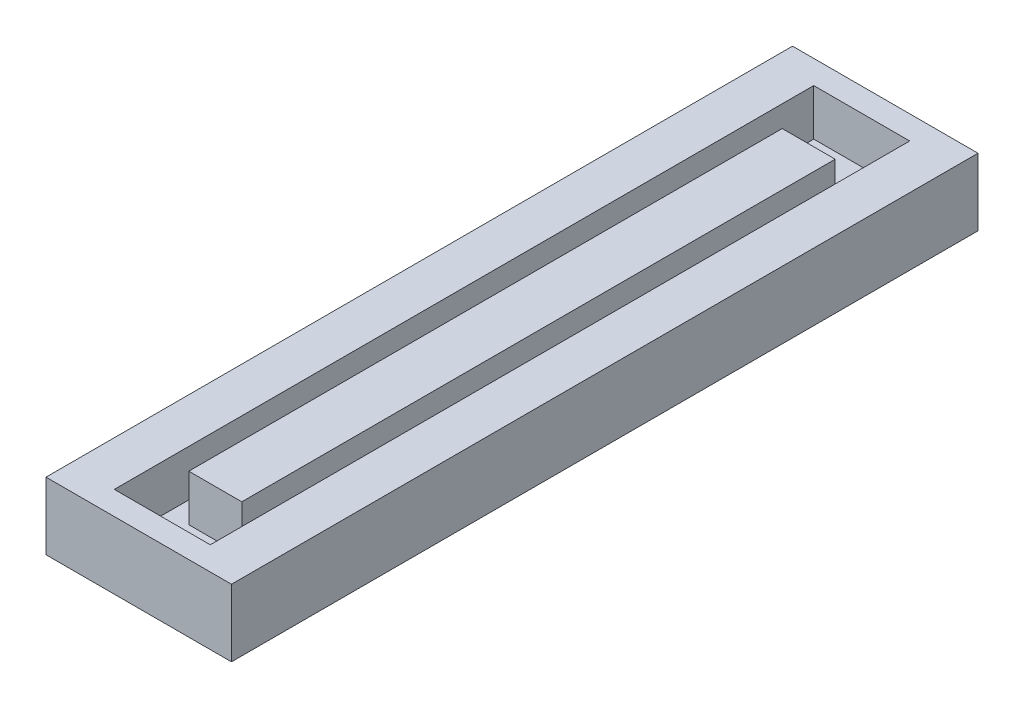
ISO-10303-21;
HEADER;
FILE_DESCRIPTION(('STEP AP214'),'2;1');
FILE_NAME('part.step','',(''),(''),'','','');
FILE_SCHEMA(('AUTOMOTIVE_DESIGN { 1 0 10303 214 1 1 1 1 }'));
ENDSEC;
DATA;
#1=APPLICATION_CONTEXT('core data for automotive mechanical design processes');
#2=APPLICATION_PROTOCOL_DEFINITION('international standard','automotive_design',2000,#1);
#3=PRODUCT_CONTEXT('',#1,'mechanical');
#4=PRODUCT('Part','Part','',(#3));
#5=PRODUCT_RELATED_PRODUCT_CATEGORY('part','',(#4));
#6=PRODUCT_DEFINITION_FORMATION('','',#4);
#7=PRODUCT_DEFINITION_CONTEXT('part definition',#1,'design');
#8=PRODUCT_DEFINITION('design','',#6,#7);
#9=PRODUCT_DEFINITION_SHAPE('','',#8);
#10=(LENGTH_UNIT() NAMED_UNIT(*) SI_UNIT(.MILLI.,.METRE.));
#11=(NAMED_UNIT(*) PLANE_ANGLE_UNIT() SI_UNIT($,.RADIAN.));
#12=(NAMED_UNIT(*) SI_UNIT($,.STERADIAN.) SOLID_ANGLE_UNIT());
#13=UNCERTAINTY_MEASURE_WITH_UNIT(LENGTH_MEASURE(1.E-05),#10,'distance_accuracy_value','');
#14=(GEOMETRIC_REPRESENTATION_CONTEXT(3) GLOBAL_UNCERTAINTY_ASSIGNED_CONTEXT((#13)) GLOBAL_UNIT_ASSIGNED_CONTEXT((#10,
#11,#12)) REPRESENTATION_CONTEXT('',''));
#15=CARTESIAN_POINT('',(0.,0.,0.));
#16=DIRECTION('',(0.,0.,1.));
#17=DIRECTION('',(1.,0.,0.));
#18=AXIS2_PLACEMENT_3D('',#15,#16,#17);
#19=CARTESIAN_POINT('',(1.0348,0.45,-7.542));
#20=DIRECTION('',(0.,1.,0.));
#21=DIRECTION('',(-1.,0.,0.));
#22=AXIS2_PLACEMENT_3D('',#19,#20,#21);
#23=PLANE('',#22);
#24=DIRECTION('',(0.,0.,-1.));
#25=VECTOR('',#24,1.);
#26=CARTESIAN_POINT('',(1.0348,0.45,7.542));
#27=LINE('',#26,#25);
#28=CARTESIAN_POINT('',(1.0348,0.45,7.542));
#29=VERTEX_POINT('',#28);
#30=CARTESIAN_POINT('',(1.0348,0.45,-7.542));
#31=VERTEX_POINT('',#30);
#32=EDGE_CURVE('E154',#29,#31,#27,.T.);
#33=ORIENTED_EDGE('',*,*,#32,.T.);
#34=DIRECTION('',(-1.,0.,0.));
#35=VECTOR('',#34,1.);
#36=CARTESIAN_POINT('',(1.0348,0.45,-7.542));
#37=LINE('',#36,#35);
#38=CARTESIAN_POINT('',(-1.0348,0.45,-7.542));
#39=VERTEX_POINT('',#38);
#40=EDGE_CURVE('E157',#31,#39,#37,.T.);
#41=ORIENTED_EDGE('',*,*,#40,.T.);
#42=DIRECTION('',(0.,0.,1.));
#43=VECTOR('',#42,1.);
#44=CARTESIAN_POINT('',(-1.0348,0.45,-7.542));
#45=LINE('',#44,#43);
#46=CARTESIAN_POINT('',(-1.0348,0.45,7.542));
#47=VERTEX_POINT('',#46);
#48=EDGE_CURVE('E161',#39,#47,#45,.T.);
#49=ORIENTED_EDGE('',*,*,#48,.T.);
#50=DIRECTION('',(1.,0.,0.));
#51=VECTOR('',#50,1.);
#52=CARTESIAN_POINT('',(-1.0348,0.45,7.542));
#53=LINE('',#52,#51);
#54=EDGE_CURVE('E164',#47,#29,#53,.T.);
#55=ORIENTED_EDGE('',*,*,#54,.T.);
#56=EDGE_LOOP('',(#33,#41,#49,#55));
#57=FACE_BOUND('',#56,.T.);
#58=DIRECTION('',(1.,0.,0.));
#59=VECTOR('',#58,1.);
#60=CARTESIAN_POINT('',(0.5715,0.45,6.399));
#61=LINE('',#60,#59);
#62=CARTESIAN_POINT('',(-0.5715,0.45,6.399));
#63=VERTEX_POINT('',#62);
#64=CARTESIAN_POINT('',(0.5715,0.45,6.399));
#65=VERTEX_POINT('',#64);
#66=EDGE_CURVE('E378',#63,#65,#61,.T.);
#67=ORIENTED_EDGE('',*,*,#66,.F.);
#68=DIRECTION('',(0.,0.,1.));
#69=VECTOR('',#68,1.);
#70=CARTESIAN_POINT('',(-0.5715,0.45,6.399));
#71=LINE('',#70,#69);
#72=CARTESIAN_POINT('',(-0.5715,0.45,-6.399));
#73=VERTEX_POINT('',#72);
#74=EDGE_CURVE('E146',#73,#63,#71,.T.);
#75=ORIENTED_EDGE('',*,*,#74,.F.);
#76=DIRECTION('',(-1.,0.,0.));
#77=VECTOR('',#76,1.);
#78=CARTESIAN_POINT('',(-0.5715,0.45,-6.399));
#79=LINE('',#78,#77);
#80=CARTESIAN_POINT('',(0.5715,0.45,-6.399));
#81=VERTEX_POINT('',#80);
#82=EDGE_CURVE('E142',#81,#73,#79,.T.);
#83=ORIENTED_EDGE('',*,*,#82,.F.);
#84=DIRECTION('',(0.,0.,-1.));
#85=VECTOR('',#84,1.);
#86=CARTESIAN_POINT('',(0.5715,0.45,-6.399));
#87=LINE('',#86,#85);
#88=EDGE_CURVE('E375',#65,#81,#87,.T.);
#89=ORIENTED_EDGE('',*,*,#88,.F.);
#90=EDGE_LOOP('',(#67,#75,#83,#89));
#91=FACE_BOUND('',#90,.T.);
#92=ADVANCED_FACE('F33',(#57,#91),#23,.T.);
#93=CARTESIAN_POINT('',(2.,0.,8.05));
#94=DIRECTION('',(1.,0.,0.));
#95=DIRECTION('',(0.,0.,-1.));
#96=AXIS2_PLACEMENT_3D('',#93,#94,#95);
#97=PLANE('',#96);
#98=DIRECTION('',(0.,0.,-1.));
#99=VECTOR('',#98,1.);
#100=CARTESIAN_POINT('',(2.,1.45,8.05));
#101=LINE('',#100,#99);
#102=CARTESIAN_POINT('',(2.,1.45,8.05));
#103=VERTEX_POINT('',#102);
#104=CARTESIAN_POINT('',(2.,1.45,-8.05));
#105=VERTEX_POINT('',#104);
#106=EDGE_CURVE('E177',#103,#105,#101,.T.);
#107=ORIENTED_EDGE('',*,*,#106,.F.);
#108=DIRECTION('',(0.,1.,0.));
#109=VECTOR('',#108,1.);
#110=CARTESIAN_POINT('',(2.,0.,8.05));
#111=LINE('',#110,#109);
#112=CARTESIAN_POINT('',(2.,0.,8.05));
#113=VERTEX_POINT('',#112);
#114=EDGE_CURVE('E11',#113,#103,#111,.T.);
#115=ORIENTED_EDGE('',*,*,#114,.F.);
#116=DIRECTION('',(0.,0.,-1.));
#117=VECTOR('',#116,1.);
#118=CARTESIAN_POINT('',(2.,0.,8.05));
#119=LINE('',#118,#117);
#120=CARTESIAN_POINT('',(2.,0.,-8.05));
#121=VERTEX_POINT('',#120);
#122=EDGE_CURVE('E183',#113,#121,#119,.T.);
#123=ORIENTED_EDGE('',*,*,#122,.T.);
#124=DIRECTION('',(0.,1.,0.));
#125=VECTOR('',#124,1.);
#126=CARTESIAN_POINT('',(2.,0.,-8.05));
#127=LINE('',#126,#125);
#128=EDGE_CURVE('E37',#121,#105,#127,.T.);
#129=ORIENTED_EDGE('',*,*,#128,.T.);
#130=EDGE_LOOP('',(#107,#115,#123,#129));
#131=FACE_BOUND('',#130,.T.);
#132=ADVANCED_FACE('F35',(#131),#97,.T.);
#133=CARTESIAN_POINT('',(-2.,0.,8.05));
#134=DIRECTION('',(0.,0.,1.));
#135=DIRECTION('',(1.,0.,0.));
#136=AXIS2_PLACEMENT_3D('',#133,#134,#135);
#137=PLANE('',#136);
#138=DIRECTION('',(1.,0.,0.));
#139=VECTOR('',#138,1.);
#140=CARTESIAN_POINT('',(-2.,1.45,8.05));
#141=LINE('',#140,#139);
#142=CARTESIAN_POINT('',(-2.,1.45,8.05));
#143=VERTEX_POINT('',#142);
#144=EDGE_CURVE('E187',#143,#103,#141,.T.);
#145=ORIENTED_EDGE('',*,*,#144,.F.);
#146=DIRECTION('',(0.,1.,0.));
#147=VECTOR('',#146,1.);
#148=CARTESIAN_POINT('',(-2.,0.,8.05));
#149=LINE('',#148,#147);
#150=CARTESIAN_POINT('',(-2.,0.,8.05));
#151=VERTEX_POINT('',#150);
#152=EDGE_CURVE('E42',#151,#143,#149,.T.);
#153=ORIENTED_EDGE('',*,*,#152,.F.);
#154=DIRECTION('',(1.,0.,0.));
#155=VECTOR('',#154,1.);
#156=CARTESIAN_POINT('',(-2.,0.,8.05));
#157=LINE('',#156,#155);
#158=EDGE_CURVE('E193',#151,#113,#157,.T.);
#159=ORIENTED_EDGE('',*,*,#158,.T.);
#160=ORIENTED_EDGE('',*,*,#114,.T.);
#161=EDGE_LOOP('',(#145,#153,#159,#160));
#162=FACE_BOUND('',#161,.T.);
#163=ADVANCED_FACE('F219',(#162),#137,.T.);
#164=CARTESIAN_POINT('',(-2.,0.,-8.05));
#165=DIRECTION('',(-1.,0.,0.));
#166=DIRECTION('',(0.,0.,1.));
#167=AXIS2_PLACEMENT_3D('',#164,#165,#166);
#168=PLANE('',#167);
#169=DIRECTION('',(0.,0.,1.));
#170=VECTOR('',#169,1.);
#171=CARTESIAN_POINT('',(-2.,1.45,-8.05));
#172=LINE('',#171,#170);
#173=CARTESIAN_POINT('',(-2.,1.45,-8.05));
#174=VERTEX_POINT('',#173);
#175=EDGE_CURVE('E201',#174,#143,#172,.T.);
#176=ORIENTED_EDGE('',*,*,#175,.F.);
#177=DIRECTION('',(0.,1.,0.));
#178=VECTOR('',#177,1.);
#179=CARTESIAN_POINT('',(-2.,0.,-8.05));
#180=LINE('',#179,#178);
#181=CARTESIAN_POINT('',(-2.,0.,-8.05));
#182=VERTEX_POINT('',#181);
#183=EDGE_CURVE('E206',#182,#174,#180,.T.);
#184=ORIENTED_EDGE('',*,*,#183,.F.);
#185=DIRECTION('',(0.,0.,1.));
#186=VECTOR('',#185,1.);
#187=CARTESIAN_POINT('',(-2.,0.,-8.05));
#188=LINE('',#187,#186);
#189=EDGE_CURVE('E190',#182,#151,#188,.T.);
#190=ORIENTED_EDGE('',*,*,#189,.T.);
#191=ORIENTED_EDGE('',*,*,#152,.T.);
#192=EDGE_LOOP('',(#176,#184,#190,#191));
#193=FACE_BOUND('',#192,.T.);
#194=ADVANCED_FACE('F225',(#193),#168,.T.);
#195=CARTESIAN_POINT('',(2.,0.,-8.05));
#196=DIRECTION('',(0.,0.,-1.));
#197=DIRECTION('',(-1.,0.,0.));
#198=AXIS2_PLACEMENT_3D('',#195,#196,#197);
#199=PLANE('',#198);
#200=DIRECTION('',(-1.,0.,0.));
#201=VECTOR('',#200,1.);
#202=CARTESIAN_POINT('',(2.,1.45,-8.05));
#203=LINE('',#202,#201);
#204=EDGE_CURVE('E198',#105,#174,#203,.T.);
#205=ORIENTED_EDGE('',*,*,#204,.F.);
#206=ORIENTED_EDGE('',*,*,#128,.F.);
#207=DIRECTION('',(-1.,0.,0.));
#208=VECTOR('',#207,1.);
#209=CARTESIAN_POINT('',(2.,0.,-8.05));
#210=LINE('',#209,#208);
#211=EDGE_CURVE('E186',#121,#182,#210,.T.);
#212=ORIENTED_EDGE('',*,*,#211,.T.);
#213=ORIENTED_EDGE('',*,*,#183,.T.);
#214=EDGE_LOOP('',(#205,#206,#212,#213));
#215=FACE_BOUND('',#214,.T.);
#216=ADVANCED_FACE('F214',(#215),#199,.T.);
#217=CARTESIAN_POINT('',(2.,0.,-8.05));
#218=DIRECTION('',(0.,1.,0.));
#219=DIRECTION('',(0.,0.,1.));
#220=AXIS2_PLACEMENT_3D('',#217,#218,#219);
#221=PLANE('',#220);
#222=ORIENTED_EDGE('',*,*,#122,.F.);
#223=ORIENTED_EDGE('',*,*,#158,.F.);
#224=ORIENTED_EDGE('',*,*,#189,.F.);
#225=ORIENTED_EDGE('',*,*,#211,.F.);
#226=EDGE_LOOP('',(#222,#223,#224,#225));
#227=FACE_BOUND('',#226,.T.);
#228=ADVANCED_FACE('F222',(#227),#221,.F.);
#229=CARTESIAN_POINT('',(2.,1.45,-8.05));
#230=DIRECTION('',(0.,1.,0.));
#231=DIRECTION('',(0.,0.,1.));
#232=AXIS2_PLACEMENT_3D('',#229,#230,#231);
#233=PLANE('',#232);
#234=DIRECTION('',(0.,0.,-1.));
#235=VECTOR('',#234,1.);
#236=CARTESIAN_POINT('',(1.0348,1.45,7.542));
#237=LINE('',#236,#235);
#238=CARTESIAN_POINT('',(1.0348,1.45,7.542));
#239=VERTEX_POINT('',#238);
#240=CARTESIAN_POINT('',(1.0348,1.45,-7.542));
#241=VERTEX_POINT('',#240);
#242=EDGE_CURVE('E58',#239,#241,#237,.T.);
#243=ORIENTED_EDGE('',*,*,#242,.F.);
#244=DIRECTION('',(1.,0.,0.));
#245=VECTOR('',#244,1.);
#246=CARTESIAN_POINT('',(-1.0348,1.45,7.542));
#247=LINE('',#246,#245);
#248=CARTESIAN_POINT('',(-1.0348,1.45,7.542));
#249=VERTEX_POINT('',#248);
#250=EDGE_CURVE('E158',#249,#239,#247,.T.);
#251=ORIENTED_EDGE('',*,*,#250,.F.);
#252=DIRECTION('',(0.,0.,1.));
#253=VECTOR('',#252,1.);
#254=CARTESIAN_POINT('',(-1.0348,1.45,-7.542));
#255=LINE('',#254,#253);
#256=CARTESIAN_POINT('',(-1.0348,1.45,-7.542));
#257=VERTEX_POINT('',#256);
#258=EDGE_CURVE('E170',#257,#249,#255,.T.);
#259=ORIENTED_EDGE('',*,*,#258,.F.);
#260=DIRECTION('',(-1.,0.,0.));
#261=VECTOR('',#260,1.);
#262=CARTESIAN_POINT('',(1.0348,1.45,-7.542));
#263=LINE('',#262,#261);
#264=EDGE_CURVE('E149',#241,#257,#263,.T.);
#265=ORIENTED_EDGE('',*,*,#264,.F.);
#266=EDGE_LOOP('',(#243,#251,#259,#265));
#267=FACE_BOUND('',#266,.T.);
#268=ORIENTED_EDGE('',*,*,#106,.T.);
#269=ORIENTED_EDGE('',*,*,#204,.T.);
#270=ORIENTED_EDGE('',*,*,#175,.T.);
#271=ORIENTED_EDGE('',*,*,#144,.T.);
#272=EDGE_LOOP('',(#268,#269,#270,#271));
#273=FACE_BOUND('',#272,.T.);
#274=ADVANCED_FACE('F216',(#267,#273),#233,.T.);
#275=CARTESIAN_POINT('',(1.0348,0.45,7.542));
#276=DIRECTION('',(1.,0.,0.));
#277=DIRECTION('',(0.,1.,0.));
#278=AXIS2_PLACEMENT_3D('',#275,#276,#277);
#279=PLANE('',#278);
#280=ORIENTED_EDGE('',*,*,#242,.T.);
#281=DIRECTION('',(0.,1.,0.));
#282=VECTOR('',#281,1.);
#283=CARTESIAN_POINT('',(1.0348,0.45,-7.542));
#284=LINE('',#283,#282);
#285=EDGE_CURVE('E166',#31,#241,#284,.T.);
#286=ORIENTED_EDGE('',*,*,#285,.F.);
#287=ORIENTED_EDGE('',*,*,#32,.F.);
#288=DIRECTION('',(0.,1.,0.));
#289=VECTOR('',#288,1.);
#290=CARTESIAN_POINT('',(1.0348,0.45,7.542));
#291=LINE('',#290,#289);
#292=EDGE_CURVE('E175',#29,#239,#291,.T.);
#293=ORIENTED_EDGE('',*,*,#292,.T.);
#294=EDGE_LOOP('',(#280,#286,#287,#293));
#295=FACE_BOUND('',#294,.T.);
#296=ADVANCED_FACE('F247',(#295),#279,.F.);
#297=CARTESIAN_POINT('',(-1.0348,0.45,7.542));
#298=DIRECTION('',(0.,0.,1.));
#299=DIRECTION('',(1.,0.,0.));
#300=AXIS2_PLACEMENT_3D('',#297,#298,#299);
#301=PLANE('',#300);
#302=ORIENTED_EDGE('',*,*,#250,.T.);
#303=ORIENTED_EDGE('',*,*,#292,.F.);
#304=ORIENTED_EDGE('',*,*,#54,.F.);
#305=DIRECTION('',(0.,1.,0.));
#306=VECTOR('',#305,1.);
#307=CARTESIAN_POINT('',(-1.0348,0.45,7.542));
#308=LINE('',#307,#306);
#309=EDGE_CURVE('E178',#47,#249,#308,.T.);
#310=ORIENTED_EDGE('',*,*,#309,.T.);
#311=EDGE_LOOP('',(#302,#303,#304,#310));
#312=FACE_BOUND('',#311,.T.);
#313=ADVANCED_FACE('F243',(#312),#301,.F.);
#314=CARTESIAN_POINT('',(-1.0348,0.45,-7.542));
#315=DIRECTION('',(-1.,0.,0.));
#316=DIRECTION('',(0.,-1.,0.));
#317=AXIS2_PLACEMENT_3D('',#314,#315,#316);
#318=PLANE('',#317);
#319=ORIENTED_EDGE('',*,*,#258,.T.);
#320=ORIENTED_EDGE('',*,*,#309,.F.);
#321=ORIENTED_EDGE('',*,*,#48,.F.);
#322=DIRECTION('',(0.,1.,0.));
#323=VECTOR('',#322,1.);
#324=CARTESIAN_POINT('',(-1.0348,0.45,-7.542));
#325=LINE('',#324,#323);
#326=EDGE_CURVE('E180',#39,#257,#325,.T.);
#327=ORIENTED_EDGE('',*,*,#326,.T.);
#328=EDGE_LOOP('',(#319,#320,#321,#327));
#329=FACE_BOUND('',#328,.T.);
#330=ADVANCED_FACE('F246',(#329),#318,.F.);
#331=CARTESIAN_POINT('',(1.0348,0.45,-7.542));
#332=DIRECTION('',(0.,0.,-1.));
#333=DIRECTION('',(-1.,0.,0.));
#334=AXIS2_PLACEMENT_3D('',#331,#332,#333);
#335=PLANE('',#334);
#336=ORIENTED_EDGE('',*,*,#264,.T.);
#337=ORIENTED_EDGE('',*,*,#326,.F.);
#338=ORIENTED_EDGE('',*,*,#40,.F.);
#339=ORIENTED_EDGE('',*,*,#285,.T.);
#340=EDGE_LOOP('',(#336,#337,#338,#339));
#341=FACE_BOUND('',#340,.T.);
#342=ADVANCED_FACE('F251',(#341),#335,.F.);
#343=CARTESIAN_POINT('',(-0.5715,1.45,6.399));
#344=DIRECTION('',(1.,0.,0.));
#345=DIRECTION('',(0.,1.,0.));
#346=AXIS2_PLACEMENT_3D('',#343,#344,#345);
#347=PLANE('',#346);
#348=ORIENTED_EDGE('',*,*,#74,.T.);
#349=DIRECTION('',(0.,-1.,0.));
#350=VECTOR('',#349,1.);
#351=CARTESIAN_POINT('',(-0.5715,1.45,6.399));
#352=LINE('',#351,#350);
#353=CARTESIAN_POINT('',(-0.5715,1.45,6.399));
#354=VERTEX_POINT('',#353);
#355=EDGE_CURVE('E127',#354,#63,#352,.T.);
#356=ORIENTED_EDGE('',*,*,#355,.F.);
#357=DIRECTION('',(0.,0.,1.));
#358=VECTOR('',#357,1.);
#359=CARTESIAN_POINT('',(-0.5715,1.45,6.399));
#360=LINE('',#359,#358);
#361=CARTESIAN_POINT('',(-0.5715,1.45,-6.399));
#362=VERTEX_POINT('',#361);
#363=EDGE_CURVE('E134',#362,#354,#360,.T.);
#364=ORIENTED_EDGE('',*,*,#363,.F.);
#365=DIRECTION('',(0.,-1.,0.));
#366=VECTOR('',#365,1.);
#367=CARTESIAN_POINT('',(-0.5715,1.45,-6.399));
#368=LINE('',#367,#366);
#369=EDGE_CURVE('E373',#362,#73,#368,.T.);
#370=ORIENTED_EDGE('',*,*,#369,.T.);
#371=EDGE_LOOP('',(#348,#356,#364,#370));
#372=FACE_BOUND('',#371,.T.);
#373=ADVANCED_FACE('F144',(#372),#347,.F.);
#374=CARTESIAN_POINT('',(0.5715,1.45,6.399));
#375=DIRECTION('',(0.,0.,-1.));
#376=DIRECTION('',(0.,1.,0.));
#377=AXIS2_PLACEMENT_3D('',#374,#375,#376);
#378=PLANE('',#377);
#379=ORIENTED_EDGE('',*,*,#66,.T.);
#380=DIRECTION('',(0.,-1.,0.));
#381=VECTOR('',#380,1.);
#382=CARTESIAN_POINT('',(0.5715,1.45,6.399));
#383=LINE('',#382,#381);
#384=CARTESIAN_POINT('',(0.5715,1.45,6.399));
#385=VERTEX_POINT('',#384);
#386=EDGE_CURVE('E130',#385,#65,#383,.T.);
#387=ORIENTED_EDGE('',*,*,#386,.F.);
#388=DIRECTION('',(1.,0.,0.));
#389=VECTOR('',#388,1.);
#390=CARTESIAN_POINT('',(0.5715,1.45,6.399));
#391=LINE('',#390,#389);
#392=EDGE_CURVE('E123',#354,#385,#391,.T.);
#393=ORIENTED_EDGE('',*,*,#392,.F.);
#394=ORIENTED_EDGE('',*,*,#355,.T.);
#395=EDGE_LOOP('',(#379,#387,#393,#394));
#396=FACE_BOUND('',#395,.T.);
#397=ADVANCED_FACE('F125',(#396),#378,.F.);
#398=CARTESIAN_POINT('',(0.5715,1.45,-6.399));
#399=DIRECTION('',(-1.,0.,0.));
#400=DIRECTION('',(0.,-1.,0.));
#401=AXIS2_PLACEMENT_3D('',#398,#399,#400);
#402=PLANE('',#401);
#403=ORIENTED_EDGE('',*,*,#88,.T.);
#404=DIRECTION('',(0.,-1.,0.));
#405=VECTOR('',#404,1.);
#406=CARTESIAN_POINT('',(0.5715,1.45,-6.399));
#407=LINE('',#406,#405);
#408=CARTESIAN_POINT('',(0.5715,1.45,-6.399));
#409=VERTEX_POINT('',#408);
#410=EDGE_CURVE('E50',#409,#81,#407,.T.);
#411=ORIENTED_EDGE('',*,*,#410,.F.);
#412=DIRECTION('',(0.,0.,-1.));
#413=VECTOR('',#412,1.);
#414=CARTESIAN_POINT('',(0.5715,1.45,-6.399));
#415=LINE('',#414,#413);
#416=EDGE_CURVE('E133',#385,#409,#415,.T.);
#417=ORIENTED_EDGE('',*,*,#416,.F.);
#418=ORIENTED_EDGE('',*,*,#386,.T.);
#419=EDGE_LOOP('',(#403,#411,#417,#418));
#420=FACE_BOUND('',#419,.T.);
#421=ADVANCED_FACE('F300',(#420),#402,.F.);
#422=CARTESIAN_POINT('',(-0.5715,1.45,-6.399));
#423=DIRECTION('',(0.,0.,1.));
#424=DIRECTION('',(0.,-1.,0.));
#425=AXIS2_PLACEMENT_3D('',#422,#423,#424);
#426=PLANE('',#425);
#427=ORIENTED_EDGE('',*,*,#82,.T.);
#428=ORIENTED_EDGE('',*,*,#369,.F.);
#429=DIRECTION('',(-1.,0.,0.));
#430=VECTOR('',#429,1.);
#431=CARTESIAN_POINT('',(-0.5715,1.45,-6.399));
#432=LINE('',#431,#430);
#433=EDGE_CURVE('E138',#409,#362,#432,.T.);
#434=ORIENTED_EDGE('',*,*,#433,.F.);
#435=ORIENTED_EDGE('',*,*,#410,.T.);
#436=EDGE_LOOP('',(#427,#428,#434,#435));
#437=FACE_BOUND('',#436,.T.);
#438=ADVANCED_FACE('F306',(#437),#426,.F.);
#439=CARTESIAN_POINT('',(-0.5715,1.45,-6.399));
#440=DIRECTION('',(0.,-1.,0.));
#441=DIRECTION('',(1.,0.,0.));
#442=AXIS2_PLACEMENT_3D('',#439,#440,#441);
#443=PLANE('',#442);
#444=ORIENTED_EDGE('',*,*,#363,.T.);
#445=ORIENTED_EDGE('',*,*,#392,.T.);
#446=ORIENTED_EDGE('',*,*,#416,.T.);
#447=ORIENTED_EDGE('',*,*,#433,.T.);
#448=EDGE_LOOP('',(#444,#445,#446,#447));
#449=FACE_BOUND('',#448,.T.);
#450=ADVANCED_FACE('F137',(#449),#443,.F.);
#451=CLOSED_SHELL('',(#92,#132,#163,#194,#216,#228,#274,#296,#313,#330,#342,#373,#397,#421,#438,#450));
#452=MANIFOLD_SOLID_BREP('B2',#451);
#453=ADVANCED_BREP_SHAPE_REPRESENTATION('',(#18,#452),#14);
#454=SHAPE_DEFINITION_REPRESENTATION(#9,#453);
ENDSEC;
END-ISO-10303-21;
